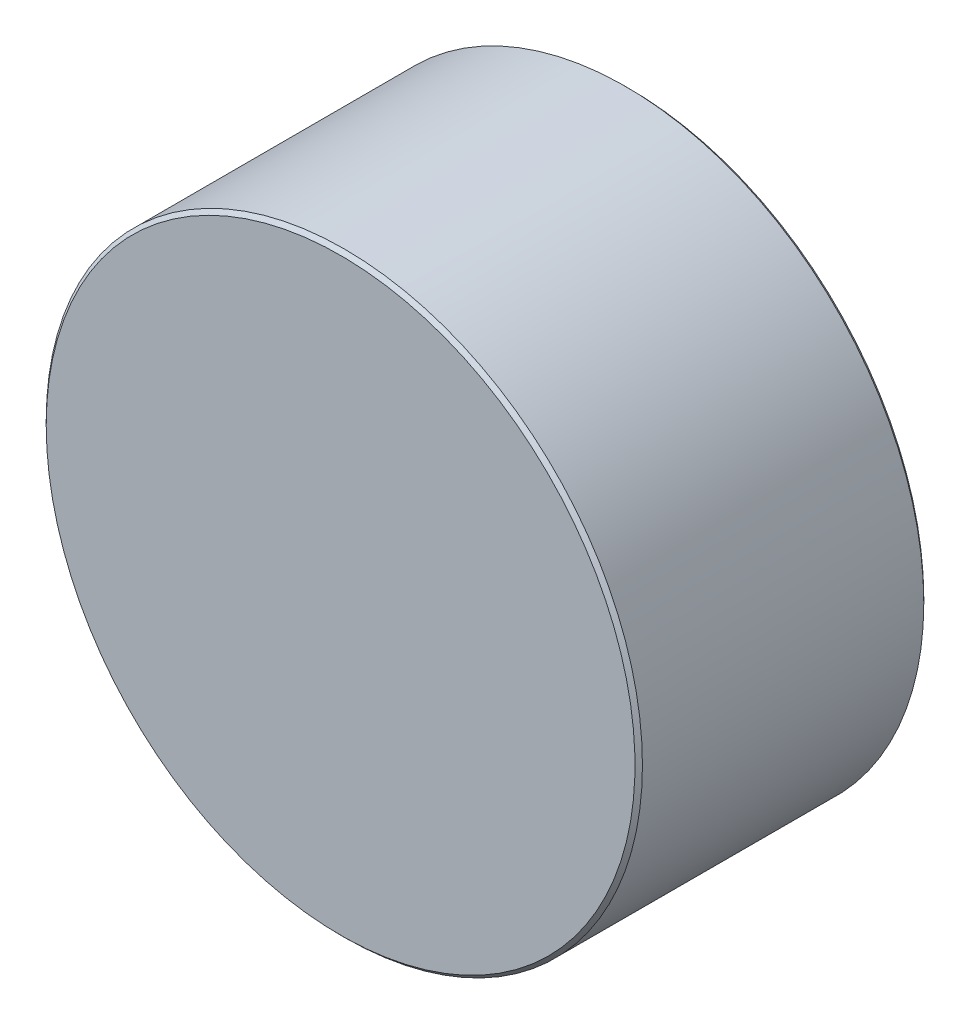
ISO-10303-21;
HEADER;
FILE_DESCRIPTION(('STEP AP214'),'2;1');
FILE_NAME('part.step','',(''),(''),'','','');
FILE_SCHEMA(('AUTOMOTIVE_DESIGN { 1 0 10303 214 1 1 1 1 }'));
ENDSEC;
DATA;
#1=APPLICATION_CONTEXT('core data for automotive mechanical design processes');
#2=APPLICATION_PROTOCOL_DEFINITION('international standard','automotive_design',2000,#1);
#3=PRODUCT_CONTEXT('',#1,'mechanical');
#4=PRODUCT('Part','Part','',(#3));
#5=PRODUCT_RELATED_PRODUCT_CATEGORY('part','',(#4));
#6=PRODUCT_DEFINITION_FORMATION('','',#4);
#7=PRODUCT_DEFINITION_CONTEXT('part definition',#1,'design');
#8=PRODUCT_DEFINITION('design','',#6,#7);
#9=PRODUCT_DEFINITION_SHAPE('','',#8);
#10=(LENGTH_UNIT() NAMED_UNIT(*) SI_UNIT(.MILLI.,.METRE.));
#11=(NAMED_UNIT(*) PLANE_ANGLE_UNIT() SI_UNIT($,.RADIAN.));
#12=(NAMED_UNIT(*) SI_UNIT($,.STERADIAN.) SOLID_ANGLE_UNIT());
#13=UNCERTAINTY_MEASURE_WITH_UNIT(LENGTH_MEASURE(1.E-05),#10,'distance_accuracy_value','');
#14=(GEOMETRIC_REPRESENTATION_CONTEXT(3) GLOBAL_UNCERTAINTY_ASSIGNED_CONTEXT((#13)) GLOBAL_UNIT_ASSIGNED_CONTEXT((#10,
#11,#12)) REPRESENTATION_CONTEXT('',''));
#15=CARTESIAN_POINT('',(0.,0.,0.));
#16=DIRECTION('',(0.,0.,1.));
#17=DIRECTION('',(1.,0.,0.));
#18=AXIS2_PLACEMENT_3D('',#15,#16,#17);
#19=CARTESIAN_POINT('',(0.,0.,-79.95));
#20=DIRECTION('',(0.,0.,-1.));
#21=DIRECTION('',(-1.,0.,0.));
#22=AXIS2_PLACEMENT_3D('',#19,#20,#21);
#23=PLANE('',#22);
#24=CARTESIAN_POINT('',(0.,0.,-79.95));
#25=DIRECTION('',(0.,0.,-1.));
#26=DIRECTION('',(-1.,0.,0.));
#27=AXIS2_PLACEMENT_3D('',#24,#25,#26);
#28=CIRCLE('',#27,15.8);
#29=CARTESIAN_POINT('',(-15.8,0.,-79.95));
#30=VERTEX_POINT('',#29);
#31=EDGE_CURVE('E17',#30,#30,#28,.T.);
#32=ORIENTED_EDGE('',*,*,#31,.F.);
#33=EDGE_LOOP('',(#32));
#34=FACE_BOUND('',#33,.T.);
#35=ADVANCED_FACE('F14',(#34),#23,.F.);
#36=CARTESIAN_POINT('',(0.,0.,-80.15));
#37=DIRECTION('',(0.,0.,-1.));
#38=DIRECTION('',(-1.,0.,0.));
#39=AXIS2_PLACEMENT_3D('',#36,#37,#38);
#40=CONICAL_SURFACE('',#39,16.,0.785398163397457);
#41=CARTESIAN_POINT('',(0.,0.,-80.15));
#42=DIRECTION('',(0.,0.,1.));
#43=DIRECTION('',(1.,0.,0.));
#44=AXIS2_PLACEMENT_3D('',#41,#42,#43);
#45=CIRCLE('',#44,16.);
#46=CARTESIAN_POINT('',(16.,0.,-80.15));
#47=VERTEX_POINT('',#46);
#48=EDGE_CURVE('E25',#47,#47,#45,.F.);
#49=ORIENTED_EDGE('',*,*,#48,.F.);
#50=EDGE_LOOP('',(#49));
#51=FACE_BOUND('',#50,.T.);
#52=ORIENTED_EDGE('',*,*,#31,.T.);
#53=EDGE_LOOP('',(#52));
#54=FACE_BOUND('',#53,.T.);
#55=ADVANCED_FACE('F34',(#51,#54),#40,.T.);
#56=CARTESIAN_POINT('',(0.,0.,-95.45));
#57=DIRECTION('',(0.,0.,1.));
#58=DIRECTION('',(1.,0.,0.));
#59=AXIS2_PLACEMENT_3D('',#56,#57,#58);
#60=CYLINDRICAL_SURFACE('',#59,16.);
#61=ORIENTED_EDGE('',*,*,#48,.T.);
#62=EDGE_LOOP('',(#61));
#63=FACE_BOUND('',#62,.T.);
#64=CARTESIAN_POINT('',(0.,0.,-95.25));
#65=DIRECTION('',(0.,0.,1.));
#66=DIRECTION('',(-0.473938017546812,-0.880558206777836,0.));
#67=AXIS2_PLACEMENT_3D('',#64,#65,#66);
#68=CIRCLE('',#67,16.);
#69=CARTESIAN_POINT('',(-7.58300828074901,-14.0889313084454,-95.25));
#70=VERTEX_POINT('',#69);
#71=EDGE_CURVE('E21',#70,#70,#68,.F.);
#72=ORIENTED_EDGE('',*,*,#71,.F.);
#73=EDGE_LOOP('',(#72));
#74=FACE_BOUND('',#73,.T.);
#75=ADVANCED_FACE('F41',(#63,#74),#60,.T.);
#76=CARTESIAN_POINT('',(0.,0.,-95.25));
#77=DIRECTION('',(0.,0.,1.));
#78=DIRECTION('',(1.,0.,0.));
#79=AXIS2_PLACEMENT_3D('',#76,#77,#78);
#80=CONICAL_SURFACE('',#79,16.,0.785398163397466);
#81=ORIENTED_EDGE('',*,*,#71,.T.);
#82=EDGE_LOOP('',(#81));
#83=FACE_BOUND('',#82,.T.);
#84=CARTESIAN_POINT('',(0.,0.,-95.45));
#85=DIRECTION('',(0.,0.,1.));
#86=DIRECTION('',(1.,0.,0.));
#87=AXIS2_PLACEMENT_3D('',#84,#85,#86);
#88=CIRCLE('',#87,15.8);
#89=CARTESIAN_POINT('',(15.8,0.,-95.45));
#90=VERTEX_POINT('',#89);
#91=EDGE_CURVE('E10',#90,#90,#88,.F.);
#92=ORIENTED_EDGE('',*,*,#91,.F.);
#93=EDGE_LOOP('',(#92));
#94=FACE_BOUND('',#93,.T.);
#95=ADVANCED_FACE('F45',(#83,#94),#80,.T.);
#96=CARTESIAN_POINT('',(0.,0.,-95.45));
#97=DIRECTION('',(0.,0.,-1.));
#98=DIRECTION('',(-1.,0.,0.));
#99=AXIS2_PLACEMENT_3D('',#96,#97,#98);
#100=PLANE('',#99);
#101=ORIENTED_EDGE('',*,*,#91,.T.);
#102=EDGE_LOOP('',(#101));
#103=FACE_BOUND('',#102,.T.);
#104=ADVANCED_FACE('F43',(#103),#100,.T.);
#105=CLOSED_SHELL('',(#35,#55,#75,#95,#104));
#106=MANIFOLD_SOLID_BREP('B1',#105);
#107=ADVANCED_BREP_SHAPE_REPRESENTATION('',(#18,#106),#14);
#108=SHAPE_DEFINITION_REPRESENTATION(#9,#107);
ENDSEC;
END-ISO-10303-21;
